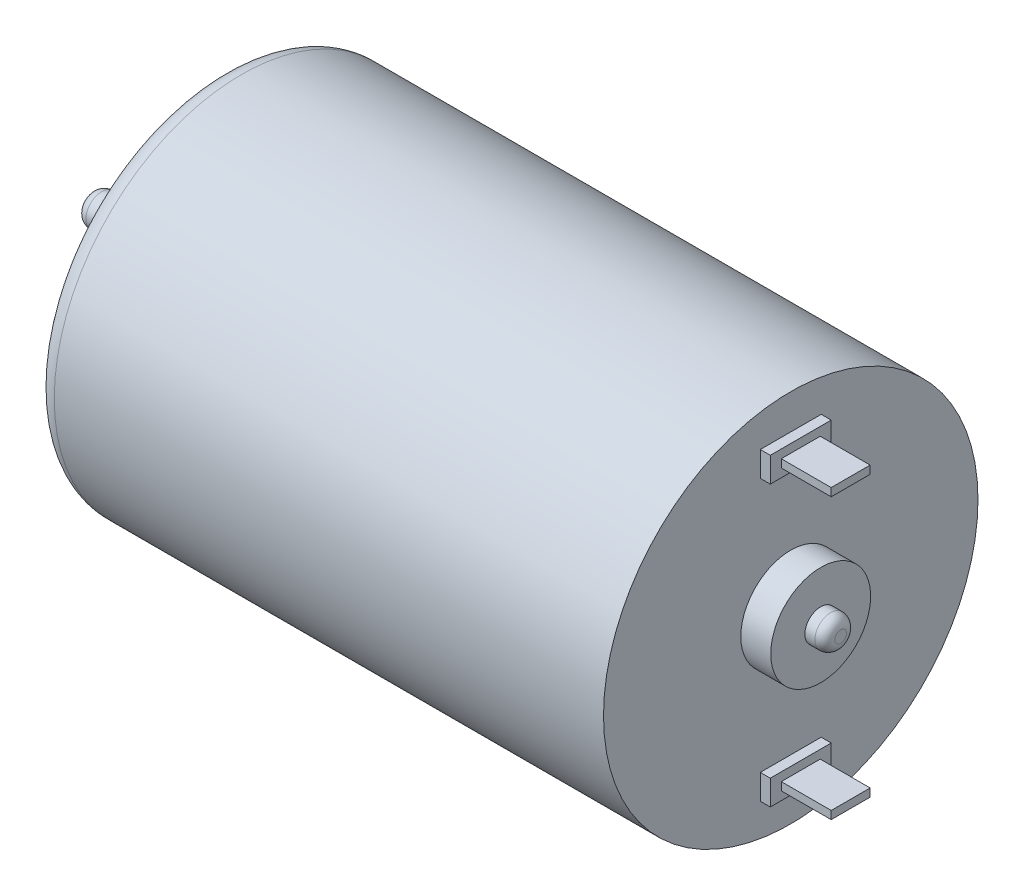
ISO-10303-21;
HEADER;
FILE_DESCRIPTION(('STEP AP214'),'2;1');
FILE_NAME('part.step','',(''),(''),'','','');
FILE_SCHEMA(('AUTOMOTIVE_DESIGN { 1 0 10303 214 1 1 1 1 }'));
ENDSEC;
DATA;
#1=APPLICATION_CONTEXT('core data for automotive mechanical design processes');
#2=APPLICATION_PROTOCOL_DEFINITION('international standard','automotive_design',2000,#1);
#3=PRODUCT_CONTEXT('',#1,'mechanical');
#4=PRODUCT('Part','Part','',(#3));
#5=PRODUCT_RELATED_PRODUCT_CATEGORY('part','',(#4));
#6=PRODUCT_DEFINITION_FORMATION('','',#4);
#7=PRODUCT_DEFINITION_CONTEXT('part definition',#1,'design');
#8=PRODUCT_DEFINITION('design','',#6,#7);
#9=PRODUCT_DEFINITION_SHAPE('','',#8);
#10=(LENGTH_UNIT() NAMED_UNIT(*) SI_UNIT(.MILLI.,.METRE.));
#11=(NAMED_UNIT(*) PLANE_ANGLE_UNIT() SI_UNIT($,.RADIAN.));
#12=(NAMED_UNIT(*) SI_UNIT($,.STERADIAN.) SOLID_ANGLE_UNIT());
#13=UNCERTAINTY_MEASURE_WITH_UNIT(LENGTH_MEASURE(1.E-05),#10,'distance_accuracy_value','');
#14=(GEOMETRIC_REPRESENTATION_CONTEXT(3) GLOBAL_UNCERTAINTY_ASSIGNED_CONTEXT((#13)) GLOBAL_UNIT_ASSIGNED_CONTEXT((#10,
#11,#12)) REPRESENTATION_CONTEXT('',''));
#15=CARTESIAN_POINT('',(0.,0.,0.));
#16=DIRECTION('',(0.,0.,1.));
#17=DIRECTION('',(1.,0.,0.));
#18=AXIS2_PLACEMENT_3D('',#15,#16,#17);
#19=CARTESIAN_POINT('',(67.5,-14.4,-1.95));
#20=DIRECTION('',(0.,1.,0.));
#21=DIRECTION('',(0.,0.,-1.));
#22=AXIS2_PLACEMENT_3D('',#19,#20,#21);
#23=PLANE('',#22);
#24=DIRECTION('',(0.,0.,1.));
#25=VECTOR('',#24,1.);
#26=CARTESIAN_POINT('',(62.5,-14.4,-1.95));
#27=LINE('',#26,#25);
#28=CARTESIAN_POINT('',(62.5,-14.4,-1.95));
#29=VERTEX_POINT('',#28);
#30=CARTESIAN_POINT('',(62.5,-14.4,1.95));
#31=VERTEX_POINT('',#30);
#32=EDGE_CURVE('E135',#29,#31,#27,.T.);
#33=ORIENTED_EDGE('',*,*,#32,.F.);
#34=DIRECTION('',(-1.,0.,0.));
#35=VECTOR('',#34,1.);
#36=CARTESIAN_POINT('',(67.5,-14.4,-1.95));
#37=LINE('',#36,#35);
#38=CARTESIAN_POINT('',(67.5,-14.4,-1.95));
#39=VERTEX_POINT('',#38);
#40=EDGE_CURVE('E134',#39,#29,#37,.T.);
#41=ORIENTED_EDGE('',*,*,#40,.F.);
#42=DIRECTION('',(0.,0.,1.));
#43=VECTOR('',#42,1.);
#44=CARTESIAN_POINT('',(67.5,-14.4,-1.95));
#45=LINE('',#44,#43);
#46=CARTESIAN_POINT('',(67.5,-14.4,1.95));
#47=VERTEX_POINT('',#46);
#48=EDGE_CURVE('E129',#39,#47,#45,.T.);
#49=ORIENTED_EDGE('',*,*,#48,.T.);
#50=DIRECTION('',(-1.,0.,0.));
#51=VECTOR('',#50,1.);
#52=CARTESIAN_POINT('',(67.5,-14.4,1.95));
#53=LINE('',#52,#51);
#54=EDGE_CURVE('E12',#47,#31,#53,.T.);
#55=ORIENTED_EDGE('',*,*,#54,.T.);
#56=EDGE_LOOP('',(#33,#41,#49,#55));
#57=FACE_BOUND('',#56,.T.);
#58=ADVANCED_FACE('F72',(#57),#23,.F.);
#59=CARTESIAN_POINT('',(67.5,-14.4,1.95));
#60=DIRECTION('',(0.,0.,-1.));
#61=DIRECTION('',(-1.,0.,0.));
#62=AXIS2_PLACEMENT_3D('',#59,#60,#61);
#63=PLANE('',#62);
#64=DIRECTION('',(0.,1.,0.));
#65=VECTOR('',#64,1.);
#66=CARTESIAN_POINT('',(62.5,-14.4,1.95));
#67=LINE('',#66,#65);
#68=CARTESIAN_POINT('',(62.5,-13.6,1.95));
#69=VERTEX_POINT('',#68);
#70=EDGE_CURVE('E137',#31,#69,#67,.T.);
#71=ORIENTED_EDGE('',*,*,#70,.F.);
#72=ORIENTED_EDGE('',*,*,#54,.F.);
#73=DIRECTION('',(0.,1.,0.));
#74=VECTOR('',#73,1.);
#75=CARTESIAN_POINT('',(67.5,-14.4,1.95));
#76=LINE('',#75,#74);
#77=CARTESIAN_POINT('',(67.5,-13.6,1.95));
#78=VERTEX_POINT('',#77);
#79=EDGE_CURVE('E113',#47,#78,#76,.T.);
#80=ORIENTED_EDGE('',*,*,#79,.T.);
#81=DIRECTION('',(-1.,0.,0.));
#82=VECTOR('',#81,1.);
#83=CARTESIAN_POINT('',(67.5,-13.6,1.95));
#84=LINE('',#83,#82);
#85=EDGE_CURVE('E80',#78,#69,#84,.T.);
#86=ORIENTED_EDGE('',*,*,#85,.T.);
#87=EDGE_LOOP('',(#71,#72,#80,#86));
#88=FACE_BOUND('',#87,.T.);
#89=ADVANCED_FACE('F127',(#88),#63,.F.);
#90=CARTESIAN_POINT('',(67.5,-13.6,-1.95));
#91=DIRECTION('',(0.,-1.,0.));
#92=DIRECTION('',(0.,0.,1.));
#93=AXIS2_PLACEMENT_3D('',#90,#91,#92);
#94=PLANE('',#93);
#95=DIRECTION('',(0.,0.,-1.));
#96=VECTOR('',#95,1.);
#97=CARTESIAN_POINT('',(62.5,-13.6,-1.95));
#98=LINE('',#97,#96);
#99=CARTESIAN_POINT('',(62.5,-13.6,-1.95));
#100=VERTEX_POINT('',#99);
#101=EDGE_CURVE('E123',#69,#100,#98,.T.);
#102=ORIENTED_EDGE('',*,*,#101,.F.);
#103=ORIENTED_EDGE('',*,*,#85,.F.);
#104=DIRECTION('',(0.,0.,-1.));
#105=VECTOR('',#104,1.);
#106=CARTESIAN_POINT('',(67.5,-13.6,-1.95));
#107=LINE('',#106,#105);
#108=CARTESIAN_POINT('',(67.5,-13.6,-1.95));
#109=VERTEX_POINT('',#108);
#110=EDGE_CURVE('E116',#78,#109,#107,.T.);
#111=ORIENTED_EDGE('',*,*,#110,.T.);
#112=DIRECTION('',(-1.,0.,0.));
#113=VECTOR('',#112,1.);
#114=CARTESIAN_POINT('',(67.5,-13.6,-1.95));
#115=LINE('',#114,#113);
#116=EDGE_CURVE('E126',#109,#100,#115,.T.);
#117=ORIENTED_EDGE('',*,*,#116,.T.);
#118=EDGE_LOOP('',(#102,#103,#111,#117));
#119=FACE_BOUND('',#118,.T.);
#120=ADVANCED_FACE('F122',(#119),#94,.F.);
#121=CARTESIAN_POINT('',(67.5,-14.4,-1.95));
#122=DIRECTION('',(0.,0.,1.));
#123=DIRECTION('',(1.,0.,0.));
#124=AXIS2_PLACEMENT_3D('',#121,#122,#123);
#125=PLANE('',#124);
#126=DIRECTION('',(0.,-1.,0.));
#127=VECTOR('',#126,1.);
#128=CARTESIAN_POINT('',(62.5,-14.4,-1.95));
#129=LINE('',#128,#127);
#130=EDGE_CURVE('E102',#100,#29,#129,.T.);
#131=ORIENTED_EDGE('',*,*,#130,.F.);
#132=ORIENTED_EDGE('',*,*,#116,.F.);
#133=DIRECTION('',(0.,-1.,0.));
#134=VECTOR('',#133,1.);
#135=CARTESIAN_POINT('',(67.5,-14.4,-1.95));
#136=LINE('',#135,#134);
#137=EDGE_CURVE('E88',#109,#39,#136,.T.);
#138=ORIENTED_EDGE('',*,*,#137,.T.);
#139=ORIENTED_EDGE('',*,*,#40,.T.);
#140=EDGE_LOOP('',(#131,#132,#138,#139));
#141=FACE_BOUND('',#140,.T.);
#142=ADVANCED_FACE('F146',(#141),#125,.F.);
#143=CARTESIAN_POINT('',(67.5,0.,0.));
#144=DIRECTION('',(1.,0.,0.));
#145=DIRECTION('',(0.,0.,-1.));
#146=AXIS2_PLACEMENT_3D('',#143,#144,#145);
#147=PLANE('',#146);
#148=ORIENTED_EDGE('',*,*,#48,.F.);
#149=ORIENTED_EDGE('',*,*,#137,.F.);
#150=ORIENTED_EDGE('',*,*,#110,.F.);
#151=ORIENTED_EDGE('',*,*,#79,.F.);
#152=EDGE_LOOP('',(#148,#149,#150,#151));
#153=FACE_BOUND('',#152,.T.);
#154=ADVANCED_FACE('F118',(#153),#147,.T.);
#155=CARTESIAN_POINT('',(62.5,0.,0.));
#156=DIRECTION('',(1.,0.,0.));
#157=DIRECTION('',(0.,0.,-1.));
#158=AXIS2_PLACEMENT_3D('',#155,#156,#157);
#159=PLANE('',#158);
#160=ORIENTED_EDGE('',*,*,#32,.T.);
#161=ORIENTED_EDGE('',*,*,#70,.T.);
#162=ORIENTED_EDGE('',*,*,#101,.T.);
#163=ORIENTED_EDGE('',*,*,#130,.T.);
#164=EDGE_LOOP('',(#160,#161,#162,#163));
#165=FACE_BOUND('',#164,.T.);
#166=ADVANCED_FACE('F142',(#165),#159,.F.);
#167=CLOSED_SHELL('',(#58,#89,#120,#142,#154,#166));
#168=MANIFOLD_SOLID_BREP('B2',#167);
#169=CARTESIAN_POINT('',(62.5,-15.25,-3.05));
#170=DIRECTION('',(0.,1.,0.));
#171=DIRECTION('',(0.,0.,-1.));
#172=AXIS2_PLACEMENT_3D('',#169,#170,#171);
#173=PLANE('',#172);
#174=DIRECTION('',(0.,0.,1.));
#175=VECTOR('',#174,1.);
#176=CARTESIAN_POINT('',(61.5,-15.25,-3.05));
#177=LINE('',#176,#175);
#178=CARTESIAN_POINT('',(61.5,-15.25,-3.05));
#179=VERTEX_POINT('',#178);
#180=CARTESIAN_POINT('',(61.5,-15.25,3.05));
#181=VERTEX_POINT('',#180);
#182=EDGE_CURVE('E305',#179,#181,#177,.T.);
#183=ORIENTED_EDGE('',*,*,#182,.F.);
#184=DIRECTION('',(-1.,0.,0.));
#185=VECTOR('',#184,1.);
#186=CARTESIAN_POINT('',(62.5,-15.25,-3.05));
#187=LINE('',#186,#185);
#188=CARTESIAN_POINT('',(62.5,-15.25,-3.05));
#189=VERTEX_POINT('',#188);
#190=EDGE_CURVE('E304',#189,#179,#187,.T.);
#191=ORIENTED_EDGE('',*,*,#190,.F.);
#192=DIRECTION('',(0.,0.,1.));
#193=VECTOR('',#192,1.);
#194=CARTESIAN_POINT('',(62.5,-15.25,-3.05));
#195=LINE('',#194,#193);
#196=CARTESIAN_POINT('',(62.5,-15.25,3.05));
#197=VERTEX_POINT('',#196);
#198=EDGE_CURVE('E299',#189,#197,#195,.T.);
#199=ORIENTED_EDGE('',*,*,#198,.T.);
#200=DIRECTION('',(-1.,0.,0.));
#201=VECTOR('',#200,1.);
#202=CARTESIAN_POINT('',(62.5,-15.25,3.05));
#203=LINE('',#202,#201);
#204=EDGE_CURVE('E70',#197,#181,#203,.T.);
#205=ORIENTED_EDGE('',*,*,#204,.T.);
#206=EDGE_LOOP('',(#183,#191,#199,#205));
#207=FACE_BOUND('',#206,.T.);
#208=ADVANCED_FACE('F242',(#207),#173,.F.);
#209=CARTESIAN_POINT('',(62.5,-15.25,3.05));
#210=DIRECTION('',(0.,0.,-1.));
#211=DIRECTION('',(0.,-1.,0.));
#212=AXIS2_PLACEMENT_3D('',#209,#210,#211);
#213=PLANE('',#212);
#214=DIRECTION('',(0.,1.,0.));
#215=VECTOR('',#214,1.);
#216=CARTESIAN_POINT('',(61.5,-15.25,3.05));
#217=LINE('',#216,#215);
#218=CARTESIAN_POINT('',(61.5,-12.75,3.05));
#219=VERTEX_POINT('',#218);
#220=EDGE_CURVE('E307',#181,#219,#217,.T.);
#221=ORIENTED_EDGE('',*,*,#220,.F.);
#222=ORIENTED_EDGE('',*,*,#204,.F.);
#223=DIRECTION('',(0.,1.,0.));
#224=VECTOR('',#223,1.);
#225=CARTESIAN_POINT('',(62.5,-15.25,3.05));
#226=LINE('',#225,#224);
#227=CARTESIAN_POINT('',(62.5,-12.75,3.05));
#228=VERTEX_POINT('',#227);
#229=EDGE_CURVE('E283',#197,#228,#226,.T.);
#230=ORIENTED_EDGE('',*,*,#229,.T.);
#231=DIRECTION('',(-1.,0.,0.));
#232=VECTOR('',#231,1.);
#233=CARTESIAN_POINT('',(62.5,-12.75,3.05));
#234=LINE('',#233,#232);
#235=EDGE_CURVE('E250',#228,#219,#234,.T.);
#236=ORIENTED_EDGE('',*,*,#235,.T.);
#237=EDGE_LOOP('',(#221,#222,#230,#236));
#238=FACE_BOUND('',#237,.T.);
#239=ADVANCED_FACE('F297',(#238),#213,.F.);
#240=CARTESIAN_POINT('',(62.5,-12.75,-3.05));
#241=DIRECTION('',(0.,-1.,0.));
#242=DIRECTION('',(0.,0.,1.));
#243=AXIS2_PLACEMENT_3D('',#240,#241,#242);
#244=PLANE('',#243);
#245=DIRECTION('',(0.,0.,-1.));
#246=VECTOR('',#245,1.);
#247=CARTESIAN_POINT('',(61.5,-12.75,-3.05));
#248=LINE('',#247,#246);
#249=CARTESIAN_POINT('',(61.5,-12.75,-3.05));
#250=VERTEX_POINT('',#249);
#251=EDGE_CURVE('E293',#219,#250,#248,.T.);
#252=ORIENTED_EDGE('',*,*,#251,.F.);
#253=ORIENTED_EDGE('',*,*,#235,.F.);
#254=DIRECTION('',(0.,0.,-1.));
#255=VECTOR('',#254,1.);
#256=CARTESIAN_POINT('',(62.5,-12.75,-3.05));
#257=LINE('',#256,#255);
#258=CARTESIAN_POINT('',(62.5,-12.75,-3.05));
#259=VERTEX_POINT('',#258);
#260=EDGE_CURVE('E286',#228,#259,#257,.T.);
#261=ORIENTED_EDGE('',*,*,#260,.T.);
#262=DIRECTION('',(-1.,0.,0.));
#263=VECTOR('',#262,1.);
#264=CARTESIAN_POINT('',(62.5,-12.75,-3.05));
#265=LINE('',#264,#263);
#266=EDGE_CURVE('E296',#259,#250,#265,.T.);
#267=ORIENTED_EDGE('',*,*,#266,.T.);
#268=EDGE_LOOP('',(#252,#253,#261,#267));
#269=FACE_BOUND('',#268,.T.);
#270=ADVANCED_FACE('F292',(#269),#244,.F.);
#271=CARTESIAN_POINT('',(62.5,-15.25,-3.05));
#272=DIRECTION('',(0.,0.,1.));
#273=DIRECTION('',(1.,0.,0.));
#274=AXIS2_PLACEMENT_3D('',#271,#272,#273);
#275=PLANE('',#274);
#276=DIRECTION('',(0.,-1.,0.));
#277=VECTOR('',#276,1.);
#278=CARTESIAN_POINT('',(61.5,-15.25,-3.05));
#279=LINE('',#278,#277);
#280=EDGE_CURVE('E272',#250,#179,#279,.T.);
#281=ORIENTED_EDGE('',*,*,#280,.F.);
#282=ORIENTED_EDGE('',*,*,#266,.F.);
#283=DIRECTION('',(0.,-1.,0.));
#284=VECTOR('',#283,1.);
#285=CARTESIAN_POINT('',(62.5,-15.25,-3.05));
#286=LINE('',#285,#284);
#287=EDGE_CURVE('E258',#259,#189,#286,.T.);
#288=ORIENTED_EDGE('',*,*,#287,.T.);
#289=ORIENTED_EDGE('',*,*,#190,.T.);
#290=EDGE_LOOP('',(#281,#282,#288,#289));
#291=FACE_BOUND('',#290,.T.);
#292=ADVANCED_FACE('F316',(#291),#275,.F.);
#293=CARTESIAN_POINT('',(62.5,0.,0.));
#294=DIRECTION('',(1.,0.,0.));
#295=DIRECTION('',(0.,0.,-1.));
#296=AXIS2_PLACEMENT_3D('',#293,#294,#295);
#297=PLANE('',#296);
#298=ORIENTED_EDGE('',*,*,#198,.F.);
#299=ORIENTED_EDGE('',*,*,#287,.F.);
#300=ORIENTED_EDGE('',*,*,#260,.F.);
#301=ORIENTED_EDGE('',*,*,#229,.F.);
#302=EDGE_LOOP('',(#298,#299,#300,#301));
#303=FACE_BOUND('',#302,.T.);
#304=ADVANCED_FACE('F288',(#303),#297,.T.);
#305=CARTESIAN_POINT('',(61.5,0.,0.));
#306=DIRECTION('',(1.,0.,0.));
#307=DIRECTION('',(0.,0.,-1.));
#308=AXIS2_PLACEMENT_3D('',#305,#306,#307);
#309=PLANE('',#308);
#310=ORIENTED_EDGE('',*,*,#182,.T.);
#311=ORIENTED_EDGE('',*,*,#220,.T.);
#312=ORIENTED_EDGE('',*,*,#251,.T.);
#313=ORIENTED_EDGE('',*,*,#280,.T.);
#314=EDGE_LOOP('',(#310,#311,#312,#313));
#315=FACE_BOUND('',#314,.T.);
#316=ADVANCED_FACE('F312',(#315),#309,.F.);
#317=CLOSED_SHELL('',(#208,#239,#270,#292,#304,#316));
#318=MANIFOLD_SOLID_BREP('B6',#317);
#319=CARTESIAN_POINT('',(67.5,14.4,-1.95));
#320=DIRECTION('',(0.,-1.,0.));
#321=DIRECTION('',(0.,0.,-1.));
#322=AXIS2_PLACEMENT_3D('',#319,#320,#321);
#323=PLANE('',#322);
#324=DIRECTION('',(0.,0.,1.));
#325=VECTOR('',#324,1.);
#326=CARTESIAN_POINT('',(62.5,14.4,-1.95));
#327=LINE('',#326,#325);
#328=CARTESIAN_POINT('',(62.5,14.4,-1.95));
#329=VERTEX_POINT('',#328);
#330=CARTESIAN_POINT('',(62.5,14.4,1.95));
#331=VERTEX_POINT('',#330);
#332=EDGE_CURVE('E475',#329,#331,#327,.T.);
#333=ORIENTED_EDGE('',*,*,#332,.T.);
#334=DIRECTION('',(-1.,0.,0.));
#335=VECTOR('',#334,1.);
#336=CARTESIAN_POINT('',(67.5,14.4,1.95));
#337=LINE('',#336,#335);
#338=CARTESIAN_POINT('',(67.5,14.4,1.95));
#339=VERTEX_POINT('',#338);
#340=EDGE_CURVE('E240',#339,#331,#337,.T.);
#341=ORIENTED_EDGE('',*,*,#340,.F.);
#342=DIRECTION('',(0.,0.,1.));
#343=VECTOR('',#342,1.);
#344=CARTESIAN_POINT('',(67.5,14.4,-1.95));
#345=LINE('',#344,#343);
#346=CARTESIAN_POINT('',(67.5,14.4,-1.95));
#347=VERTEX_POINT('',#346);
#348=EDGE_CURVE('E463',#347,#339,#345,.T.);
#349=ORIENTED_EDGE('',*,*,#348,.F.);
#350=DIRECTION('',(-1.,0.,0.));
#351=VECTOR('',#350,1.);
#352=CARTESIAN_POINT('',(67.5,14.4,-1.95));
#353=LINE('',#352,#351);
#354=EDGE_CURVE('E471',#347,#329,#353,.T.);
#355=ORIENTED_EDGE('',*,*,#354,.T.);
#356=EDGE_LOOP('',(#333,#341,#349,#355));
#357=FACE_BOUND('',#356,.T.);
#358=ADVANCED_FACE('F412',(#357),#323,.F.);
#359=CARTESIAN_POINT('',(67.5,14.4,1.95));
#360=DIRECTION('',(0.,0.,-1.));
#361=DIRECTION('',(-1.,0.,0.));
#362=AXIS2_PLACEMENT_3D('',#359,#360,#361);
#363=PLANE('',#362);
#364=DIRECTION('',(0.,-1.,0.));
#365=VECTOR('',#364,1.);
#366=CARTESIAN_POINT('',(62.5,14.4,1.95));
#367=LINE('',#366,#365);
#368=CARTESIAN_POINT('',(62.5,13.6,1.95));
#369=VERTEX_POINT('',#368);
#370=EDGE_CURVE('E467',#331,#369,#367,.T.);
#371=ORIENTED_EDGE('',*,*,#370,.T.);
#372=DIRECTION('',(-1.,0.,0.));
#373=VECTOR('',#372,1.);
#374=CARTESIAN_POINT('',(67.5,13.6,1.95));
#375=LINE('',#374,#373);
#376=CARTESIAN_POINT('',(67.5,13.6,1.95));
#377=VERTEX_POINT('',#376);
#378=EDGE_CURVE('E420',#377,#369,#375,.T.);
#379=ORIENTED_EDGE('',*,*,#378,.F.);
#380=DIRECTION('',(0.,-1.,0.));
#381=VECTOR('',#380,1.);
#382=CARTESIAN_POINT('',(67.5,14.4,1.95));
#383=LINE('',#382,#381);
#384=EDGE_CURVE('E458',#339,#377,#383,.T.);
#385=ORIENTED_EDGE('',*,*,#384,.F.);
#386=ORIENTED_EDGE('',*,*,#340,.T.);
#387=EDGE_LOOP('',(#371,#379,#385,#386));
#388=FACE_BOUND('',#387,.T.);
#389=ADVANCED_FACE('F466',(#388),#363,.F.);
#390=CARTESIAN_POINT('',(67.5,13.6,-1.95));
#391=DIRECTION('',(0.,1.,0.));
#392=DIRECTION('',(0.,0.,1.));
#393=AXIS2_PLACEMENT_3D('',#390,#391,#392);
#394=PLANE('',#393);
#395=DIRECTION('',(0.,0.,-1.));
#396=VECTOR('',#395,1.);
#397=CARTESIAN_POINT('',(62.5,13.6,-1.95));
#398=LINE('',#397,#396);
#399=CARTESIAN_POINT('',(62.5,13.6,-1.95));
#400=VERTEX_POINT('',#399);
#401=EDGE_CURVE('E445',#369,#400,#398,.T.);
#402=ORIENTED_EDGE('',*,*,#401,.T.);
#403=DIRECTION('',(-1.,0.,0.));
#404=VECTOR('',#403,1.);
#405=CARTESIAN_POINT('',(67.5,13.6,-1.95));
#406=LINE('',#405,#404);
#407=CARTESIAN_POINT('',(67.5,13.6,-1.95));
#408=VERTEX_POINT('',#407);
#409=EDGE_CURVE('E468',#408,#400,#406,.T.);
#410=ORIENTED_EDGE('',*,*,#409,.F.);
#411=DIRECTION('',(0.,0.,-1.));
#412=VECTOR('',#411,1.);
#413=CARTESIAN_POINT('',(67.5,13.6,-1.95));
#414=LINE('',#413,#412);
#415=EDGE_CURVE('E461',#377,#408,#414,.T.);
#416=ORIENTED_EDGE('',*,*,#415,.F.);
#417=ORIENTED_EDGE('',*,*,#378,.T.);
#418=EDGE_LOOP('',(#402,#410,#416,#417));
#419=FACE_BOUND('',#418,.T.);
#420=ADVANCED_FACE('F469',(#419),#394,.F.);
#421=CARTESIAN_POINT('',(67.5,14.4,-1.95));
#422=DIRECTION('',(0.,0.,1.));
#423=DIRECTION('',(1.,0.,0.));
#424=AXIS2_PLACEMENT_3D('',#421,#422,#423);
#425=PLANE('',#424);
#426=DIRECTION('',(0.,1.,0.));
#427=VECTOR('',#426,1.);
#428=CARTESIAN_POINT('',(62.5,14.4,-1.95));
#429=LINE('',#428,#427);
#430=EDGE_CURVE('E451',#400,#329,#429,.T.);
#431=ORIENTED_EDGE('',*,*,#430,.T.);
#432=ORIENTED_EDGE('',*,*,#354,.F.);
#433=DIRECTION('',(0.,1.,0.));
#434=VECTOR('',#433,1.);
#435=CARTESIAN_POINT('',(67.5,14.4,-1.95));
#436=LINE('',#435,#434);
#437=EDGE_CURVE('E428',#408,#347,#436,.T.);
#438=ORIENTED_EDGE('',*,*,#437,.F.);
#439=ORIENTED_EDGE('',*,*,#409,.T.);
#440=EDGE_LOOP('',(#431,#432,#438,#439));
#441=FACE_BOUND('',#440,.T.);
#442=ADVANCED_FACE('F482',(#441),#425,.F.);
#443=CARTESIAN_POINT('',(67.5,0.,0.));
#444=DIRECTION('',(1.,0.,0.));
#445=DIRECTION('',(0.,0.,-1.));
#446=AXIS2_PLACEMENT_3D('',#443,#444,#445);
#447=PLANE('',#446);
#448=ORIENTED_EDGE('',*,*,#348,.T.);
#449=ORIENTED_EDGE('',*,*,#384,.T.);
#450=ORIENTED_EDGE('',*,*,#415,.T.);
#451=ORIENTED_EDGE('',*,*,#437,.T.);
#452=EDGE_LOOP('',(#448,#449,#450,#451));
#453=FACE_BOUND('',#452,.T.);
#454=ADVANCED_FACE('F459',(#453),#447,.T.);
#455=CARTESIAN_POINT('',(62.5,0.,0.));
#456=DIRECTION('',(1.,0.,0.));
#457=DIRECTION('',(0.,0.,-1.));
#458=AXIS2_PLACEMENT_3D('',#455,#456,#457);
#459=PLANE('',#458);
#460=ORIENTED_EDGE('',*,*,#332,.F.);
#461=ORIENTED_EDGE('',*,*,#430,.F.);
#462=ORIENTED_EDGE('',*,*,#401,.F.);
#463=ORIENTED_EDGE('',*,*,#370,.F.);
#464=EDGE_LOOP('',(#460,#461,#462,#463));
#465=FACE_BOUND('',#464,.T.);
#466=ADVANCED_FACE('F485',(#465),#459,.F.);
#467=CLOSED_SHELL('',(#358,#389,#420,#442,#454,#466));
#468=MANIFOLD_SOLID_BREP('B64',#467);
#469=CARTESIAN_POINT('',(62.5,15.25,-3.05));
#470=DIRECTION('',(0.,-1.,0.));
#471=DIRECTION('',(0.,0.,-1.));
#472=AXIS2_PLACEMENT_3D('',#469,#470,#471);
#473=PLANE('',#472);
#474=DIRECTION('',(0.,0.,1.));
#475=VECTOR('',#474,1.);
#476=CARTESIAN_POINT('',(61.5,15.25,-3.05));
#477=LINE('',#476,#475);
#478=CARTESIAN_POINT('',(61.5,15.25,-3.05));
#479=VERTEX_POINT('',#478);
#480=CARTESIAN_POINT('',(61.5,15.25,3.05));
#481=VERTEX_POINT('',#480);
#482=EDGE_CURVE('E611',#479,#481,#477,.T.);
#483=ORIENTED_EDGE('',*,*,#482,.T.);
#484=DIRECTION('',(-1.,0.,0.));
#485=VECTOR('',#484,1.);
#486=CARTESIAN_POINT('',(62.5,15.25,3.05));
#487=LINE('',#486,#485);
#488=CARTESIAN_POINT('',(62.5,15.25,3.05));
#489=VERTEX_POINT('',#488);
#490=EDGE_CURVE('E410',#489,#481,#487,.T.);
#491=ORIENTED_EDGE('',*,*,#490,.F.);
#492=DIRECTION('',(0.,0.,1.));
#493=VECTOR('',#492,1.);
#494=CARTESIAN_POINT('',(62.5,15.25,-3.05));
#495=LINE('',#494,#493);
#496=CARTESIAN_POINT('',(62.5,15.25,-3.05));
#497=VERTEX_POINT('',#496);
#498=EDGE_CURVE('E598',#497,#489,#495,.T.);
#499=ORIENTED_EDGE('',*,*,#498,.F.);
#500=DIRECTION('',(-1.,0.,0.));
#501=VECTOR('',#500,1.);
#502=CARTESIAN_POINT('',(62.5,15.25,-3.05));
#503=LINE('',#502,#501);
#504=EDGE_CURVE('E607',#497,#479,#503,.T.);
#505=ORIENTED_EDGE('',*,*,#504,.T.);
#506=EDGE_LOOP('',(#483,#491,#499,#505));
#507=FACE_BOUND('',#506,.T.);
#508=ADVANCED_FACE('F546',(#507),#473,.F.);
#509=CARTESIAN_POINT('',(62.5,15.25,3.05));
#510=DIRECTION('',(0.,0.,-1.));
#511=DIRECTION('',(0.,1.,0.));
#512=AXIS2_PLACEMENT_3D('',#509,#510,#511);
#513=PLANE('',#512);
#514=DIRECTION('',(0.,-1.,0.));
#515=VECTOR('',#514,1.);
#516=CARTESIAN_POINT('',(61.5,15.25,3.05));
#517=LINE('',#516,#515);
#518=CARTESIAN_POINT('',(61.5,12.75,3.05));
#519=VERTEX_POINT('',#518);
#520=EDGE_CURVE('E602',#481,#519,#517,.T.);
#521=ORIENTED_EDGE('',*,*,#520,.T.);
#522=DIRECTION('',(-1.,0.,0.));
#523=VECTOR('',#522,1.);
#524=CARTESIAN_POINT('',(62.5,12.75,3.05));
#525=LINE('',#524,#523);
#526=CARTESIAN_POINT('',(62.5,12.75,3.05));
#527=VERTEX_POINT('',#526);
#528=EDGE_CURVE('E554',#527,#519,#525,.T.);
#529=ORIENTED_EDGE('',*,*,#528,.F.);
#530=DIRECTION('',(0.,-1.,0.));
#531=VECTOR('',#530,1.);
#532=CARTESIAN_POINT('',(62.5,15.25,3.05));
#533=LINE('',#532,#531);
#534=EDGE_CURVE('E593',#489,#527,#533,.T.);
#535=ORIENTED_EDGE('',*,*,#534,.F.);
#536=ORIENTED_EDGE('',*,*,#490,.T.);
#537=EDGE_LOOP('',(#521,#529,#535,#536));
#538=FACE_BOUND('',#537,.T.);
#539=ADVANCED_FACE('F601',(#538),#513,.F.);
#540=CARTESIAN_POINT('',(62.5,12.75,-3.05));
#541=DIRECTION('',(0.,1.,0.));
#542=DIRECTION('',(0.,0.,1.));
#543=AXIS2_PLACEMENT_3D('',#540,#541,#542);
#544=PLANE('',#543);
#545=DIRECTION('',(0.,0.,-1.));
#546=VECTOR('',#545,1.);
#547=CARTESIAN_POINT('',(61.5,12.75,-3.05));
#548=LINE('',#547,#546);
#549=CARTESIAN_POINT('',(61.5,12.75,-3.05));
#550=VERTEX_POINT('',#549);
#551=EDGE_CURVE('E580',#519,#550,#548,.T.);
#552=ORIENTED_EDGE('',*,*,#551,.T.);
#553=DIRECTION('',(-1.,0.,0.));
#554=VECTOR('',#553,1.);
#555=CARTESIAN_POINT('',(62.5,12.75,-3.05));
#556=LINE('',#555,#554);
#557=CARTESIAN_POINT('',(62.5,12.75,-3.05));
#558=VERTEX_POINT('',#557);
#559=EDGE_CURVE('E604',#558,#550,#556,.T.);
#560=ORIENTED_EDGE('',*,*,#559,.F.);
#561=DIRECTION('',(0.,0.,-1.));
#562=VECTOR('',#561,1.);
#563=CARTESIAN_POINT('',(62.5,12.75,-3.05));
#564=LINE('',#563,#562);
#565=EDGE_CURVE('E596',#527,#558,#564,.T.);
#566=ORIENTED_EDGE('',*,*,#565,.F.);
#567=ORIENTED_EDGE('',*,*,#528,.T.);
#568=EDGE_LOOP('',(#552,#560,#566,#567));
#569=FACE_BOUND('',#568,.T.);
#570=ADVANCED_FACE('F605',(#569),#544,.F.);
#571=CARTESIAN_POINT('',(62.5,15.25,-3.05));
#572=DIRECTION('',(0.,0.,1.));
#573=DIRECTION('',(1.,0.,0.));
#574=AXIS2_PLACEMENT_3D('',#571,#572,#573);
#575=PLANE('',#574);
#576=DIRECTION('',(0.,1.,0.));
#577=VECTOR('',#576,1.);
#578=CARTESIAN_POINT('',(61.5,15.25,-3.05));
#579=LINE('',#578,#577);
#580=EDGE_CURVE('E586',#550,#479,#579,.T.);
#581=ORIENTED_EDGE('',*,*,#580,.T.);
#582=ORIENTED_EDGE('',*,*,#504,.F.);
#583=DIRECTION('',(0.,1.,0.));
#584=VECTOR('',#583,1.);
#585=CARTESIAN_POINT('',(62.5,15.25,-3.05));
#586=LINE('',#585,#584);
#587=EDGE_CURVE('E562',#558,#497,#586,.T.);
#588=ORIENTED_EDGE('',*,*,#587,.F.);
#589=ORIENTED_EDGE('',*,*,#559,.T.);
#590=EDGE_LOOP('',(#581,#582,#588,#589));
#591=FACE_BOUND('',#590,.T.);
#592=ADVANCED_FACE('F620',(#591),#575,.F.);
#593=CARTESIAN_POINT('',(62.5,0.,0.));
#594=DIRECTION('',(1.,0.,0.));
#595=DIRECTION('',(0.,0.,-1.));
#596=AXIS2_PLACEMENT_3D('',#593,#594,#595);
#597=PLANE('',#596);
#598=ORIENTED_EDGE('',*,*,#498,.T.);
#599=ORIENTED_EDGE('',*,*,#534,.T.);
#600=ORIENTED_EDGE('',*,*,#565,.T.);
#601=ORIENTED_EDGE('',*,*,#587,.T.);
#602=EDGE_LOOP('',(#598,#599,#600,#601));
#603=FACE_BOUND('',#602,.T.);
#604=ADVANCED_FACE('F594',(#603),#597,.T.);
#605=CARTESIAN_POINT('',(61.5,0.,0.));
#606=DIRECTION('',(1.,0.,0.));
#607=DIRECTION('',(0.,0.,-1.));
#608=AXIS2_PLACEMENT_3D('',#605,#606,#607);
#609=PLANE('',#608);
#610=ORIENTED_EDGE('',*,*,#482,.F.);
#611=ORIENTED_EDGE('',*,*,#580,.F.);
#612=ORIENTED_EDGE('',*,*,#551,.F.);
#613=ORIENTED_EDGE('',*,*,#520,.F.);
#614=EDGE_LOOP('',(#610,#611,#612,#613));
#615=FACE_BOUND('',#614,.T.);
#616=ADVANCED_FACE('F623',(#615),#609,.F.);
#617=CLOSED_SHELL('',(#508,#539,#570,#592,#604,#616));
#618=MANIFOLD_SOLID_BREP('B234',#617);
#619=CARTESIAN_POINT('',(64.5,5.,0.));
#620=DIRECTION('',(-1.,0.,0.));
#621=DIRECTION('',(0.,0.,1.));
#622=AXIS2_PLACEMENT_3D('',#619,#620,#621);
#623=PLANE('',#622);
#624=CARTESIAN_POINT('',(64.5,0.,0.));
#625=DIRECTION('',(-1.,0.,0.));
#626=DIRECTION('',(0.,0.,1.));
#627=AXIS2_PLACEMENT_3D('',#624,#625,#626);
#628=CIRCLE('',#627,5.);
#629=CARTESIAN_POINT('',(64.5,0.,5.));
#630=VERTEX_POINT('',#629);
#631=EDGE_CURVE('E723',#630,#630,#628,.T.);
#632=ORIENTED_EDGE('',*,*,#631,.F.);
#633=EDGE_LOOP('',(#632));
#634=FACE_BOUND('',#633,.T.);
#635=CARTESIAN_POINT('',(64.5,0.,0.));
#636=DIRECTION('',(-1.,0.,0.));
#637=DIRECTION('',(0.,0.,1.));
#638=AXIS2_PLACEMENT_3D('',#635,#636,#637);
#639=CIRCLE('',#638,1.5875);
#640=CARTESIAN_POINT('',(64.5,0.,1.5875));
#641=VERTEX_POINT('',#640);
#642=EDGE_CURVE('E743',#641,#641,#639,.T.);
#643=ORIENTED_EDGE('',*,*,#642,.T.);
#644=EDGE_LOOP('',(#643));
#645=FACE_BOUND('',#644,.T.);
#646=ADVANCED_FACE('F683',(#634,#645),#623,.F.);
#647=CARTESIAN_POINT('',(0.,0.,0.));
#648=DIRECTION('',(-1.,0.,0.));
#649=DIRECTION('',(0.,0.,1.));
#650=AXIS2_PLACEMENT_3D('',#647,#648,#649);
#651=CYLINDRICAL_SURFACE('',#650,1.5875);
#652=ORIENTED_EDGE('',*,*,#642,.F.);
#653=EDGE_LOOP('',(#652));
#654=FACE_BOUND('',#653,.T.);
#655=CARTESIAN_POINT('',(0.,0.,0.));
#656=DIRECTION('',(-1.,0.,0.));
#657=DIRECTION('',(0.,0.,1.));
#658=AXIS2_PLACEMENT_3D('',#655,#656,#657);
#659=CIRCLE('',#658,1.5875);
#660=CARTESIAN_POINT('',(0.,0.,1.5875));
#661=VERTEX_POINT('',#660);
#662=EDGE_CURVE('E739',#661,#661,#659,.T.);
#663=ORIENTED_EDGE('',*,*,#662,.T.);
#664=EDGE_LOOP('',(#663));
#665=FACE_BOUND('',#664,.T.);
#666=ADVANCED_FACE('F773',(#654,#665),#651,.F.);
#667=CARTESIAN_POINT('',(0.,1.5875,0.));
#668=DIRECTION('',(1.,0.,0.));
#669=DIRECTION('',(0.,0.,-1.));
#670=AXIS2_PLACEMENT_3D('',#667,#668,#669);
#671=PLANE('',#670);
#672=CARTESIAN_POINT('',(0.,0.,0.));
#673=DIRECTION('',(1.,0.,0.));
#674=DIRECTION('',(0.,0.,-1.));
#675=AXIS2_PLACEMENT_3D('',#672,#673,#674);
#676=CIRCLE('',#675,5.99999999999999);
#677=CARTESIAN_POINT('',(0.,0.,-5.99999999999999));
#678=VERTEX_POINT('',#677);
#679=EDGE_CURVE('E693',#678,#678,#676,.F.);
#680=ORIENTED_EDGE('',*,*,#679,.T.);
#681=EDGE_LOOP('',(#680));
#682=FACE_BOUND('',#681,.T.);
#683=ORIENTED_EDGE('',*,*,#662,.F.);
#684=EDGE_LOOP('',(#683));
#685=FACE_BOUND('',#684,.T.);
#686=ADVANCED_FACE('F758',(#682,#685),#671,.F.);
#687=CARTESIAN_POINT('',(0.,0.,0.));
#688=DIRECTION('',(-1.,0.,0.));
#689=DIRECTION('',(0.,0.,1.));
#690=AXIS2_PLACEMENT_3D('',#687,#688,#689);
#691=CYLINDRICAL_SURFACE('',#690,6.5);
#692=CARTESIAN_POINT('',(0.500000000000011,0.,0.));
#693=DIRECTION('',(1.,0.,0.));
#694=DIRECTION('',(0.,0.,-1.));
#695=AXIS2_PLACEMENT_3D('',#692,#693,#694);
#696=CIRCLE('',#695,6.5);
#697=CARTESIAN_POINT('',(0.500000000000011,0.,-6.5));
#698=VERTEX_POINT('',#697);
#699=EDGE_CURVE('E544',#698,#698,#696,.T.);
#700=ORIENTED_EDGE('',*,*,#699,.T.);
#701=EDGE_LOOP('',(#700));
#702=FACE_BOUND('',#701,.T.);
#703=CARTESIAN_POINT('',(4.5,0.,0.));
#704=DIRECTION('',(-1.,0.,0.));
#705=DIRECTION('',(0.,0.,1.));
#706=AXIS2_PLACEMENT_3D('',#703,#704,#705);
#707=CIRCLE('',#706,6.5);
#708=CARTESIAN_POINT('',(4.5,0.,6.5));
#709=VERTEX_POINT('',#708);
#710=EDGE_CURVE('E735',#709,#709,#707,.T.);
#711=ORIENTED_EDGE('',*,*,#710,.T.);
#712=EDGE_LOOP('',(#711));
#713=FACE_BOUND('',#712,.T.);
#714=ADVANCED_FACE('F787',(#702,#713),#691,.T.);
#715=CARTESIAN_POINT('',(4.5,6.5,0.));
#716=DIRECTION('',(1.,0.,0.));
#717=DIRECTION('',(0.,0.,-1.));
#718=AXIS2_PLACEMENT_3D('',#715,#716,#717);
#719=PLANE('',#718);
#720=CARTESIAN_POINT('',(4.5,-12.5,0.));
#721=DIRECTION('',(-1.,0.,0.));
#722=DIRECTION('',(0.,0.,1.));
#723=AXIS2_PLACEMENT_3D('',#720,#721,#722);
#724=CIRCLE('',#723,1.24999999999999);
#725=CARTESIAN_POINT('',(4.5,-12.5,1.24999999999999));
#726=VERTEX_POINT('',#725);
#727=EDGE_CURVE('E710',#726,#726,#724,.T.);
#728=ORIENTED_EDGE('',*,*,#727,.F.);
#729=EDGE_LOOP('',(#728));
#730=FACE_BOUND('',#729,.T.);
#731=CARTESIAN_POINT('',(4.5,0.,0.));
#732=DIRECTION('',(1.,0.,0.));
#733=DIRECTION('',(0.,0.,-1.));
#734=AXIS2_PLACEMENT_3D('',#731,#732,#733);
#735=CIRCLE('',#734,16.75);
#736=CARTESIAN_POINT('',(4.5,0.,-16.75));
#737=VERTEX_POINT('',#736);
#738=EDGE_CURVE('E747',#737,#737,#735,.F.);
#739=ORIENTED_EDGE('',*,*,#738,.T.);
#740=EDGE_LOOP('',(#739));
#741=FACE_BOUND('',#740,.T.);
#742=CARTESIAN_POINT('',(4.5,12.5,0.));
#743=DIRECTION('',(-1.,0.,0.));
#744=DIRECTION('',(0.,0.,1.));
#745=AXIS2_PLACEMENT_3D('',#742,#743,#744);
#746=CIRCLE('',#745,1.24999999999999);
#747=CARTESIAN_POINT('',(4.5,12.5,1.24999999999999));
#748=VERTEX_POINT('',#747);
#749=EDGE_CURVE('E709',#748,#748,#746,.T.);
#750=ORIENTED_EDGE('',*,*,#749,.F.);
#751=EDGE_LOOP('',(#750));
#752=FACE_BOUND('',#751,.T.);
#753=ORIENTED_EDGE('',*,*,#710,.F.);
#754=EDGE_LOOP('',(#753));
#755=FACE_BOUND('',#754,.T.);
#756=ADVANCED_FACE('F789',(#730,#741,#752,#755),#719,.F.);
#757=CARTESIAN_POINT('',(0.,0.,0.));
#758=DIRECTION('',(-1.,0.,0.));
#759=DIRECTION('',(0.,0.,1.));
#760=AXIS2_PLACEMENT_3D('',#757,#758,#759);
#761=CYLINDRICAL_SURFACE('',#760,18.75);
#762=CARTESIAN_POINT('',(6.5,0.,0.));
#763=DIRECTION('',(1.,0.,0.));
#764=DIRECTION('',(0.,0.,-1.));
#765=AXIS2_PLACEMENT_3D('',#762,#763,#764);
#766=CIRCLE('',#765,18.75);
#767=CARTESIAN_POINT('',(6.5,0.,-18.75));
#768=VERTEX_POINT('',#767);
#769=EDGE_CURVE('E751',#768,#768,#766,.T.);
#770=ORIENTED_EDGE('',*,*,#769,.T.);
#771=EDGE_LOOP('',(#770));
#772=FACE_BOUND('',#771,.T.);
#773=CARTESIAN_POINT('',(61.5,0.,0.));
#774=DIRECTION('',(-1.,0.,0.));
#775=DIRECTION('',(0.,0.,1.));
#776=AXIS2_PLACEMENT_3D('',#773,#774,#775);
#777=CIRCLE('',#776,18.75);
#778=CARTESIAN_POINT('',(61.5,0.,18.75));
#779=VERTEX_POINT('',#778);
#780=EDGE_CURVE('E731',#779,#779,#777,.T.);
#781=ORIENTED_EDGE('',*,*,#780,.T.);
#782=EDGE_LOOP('',(#781));
#783=FACE_BOUND('',#782,.T.);
#784=ADVANCED_FACE('F793',(#772,#783),#761,.T.);
#785=CARTESIAN_POINT('',(61.5,18.75,0.));
#786=DIRECTION('',(-1.,0.,0.));
#787=DIRECTION('',(0.,0.,1.));
#788=AXIS2_PLACEMENT_3D('',#785,#786,#787);
#789=PLANE('',#788);
#790=ORIENTED_EDGE('',*,*,#780,.F.);
#791=EDGE_LOOP('',(#790));
#792=FACE_BOUND('',#791,.T.);
#793=CARTESIAN_POINT('',(61.5,0.,0.));
#794=DIRECTION('',(-1.,0.,0.));
#795=DIRECTION('',(0.,0.,1.));
#796=AXIS2_PLACEMENT_3D('',#793,#794,#795);
#797=CIRCLE('',#796,5.);
#798=CARTESIAN_POINT('',(61.5,0.,5.));
#799=VERTEX_POINT('',#798);
#800=EDGE_CURVE('E727',#799,#799,#797,.T.);
#801=ORIENTED_EDGE('',*,*,#800,.T.);
#802=EDGE_LOOP('',(#801));
#803=FACE_BOUND('',#802,.T.);
#804=ADVANCED_FACE('F796',(#792,#803),#789,.F.);
#805=CARTESIAN_POINT('',(0.,0.,0.));
#806=DIRECTION('',(-1.,0.,0.));
#807=DIRECTION('',(0.,0.,1.));
#808=AXIS2_PLACEMENT_3D('',#805,#806,#807);
#809=CYLINDRICAL_SURFACE('',#808,5.);
#810=ORIENTED_EDGE('',*,*,#800,.F.);
#811=EDGE_LOOP('',(#810));
#812=FACE_BOUND('',#811,.T.);
#813=ORIENTED_EDGE('',*,*,#631,.T.);
#814=EDGE_LOOP('',(#813));
#815=FACE_BOUND('',#814,.T.);
#816=ADVANCED_FACE('F800',(#812,#815),#809,.T.);
#817=CARTESIAN_POINT('',(13.,12.5,0.));
#818=DIRECTION('',(-1.,0.,0.));
#819=DIRECTION('',(0.,0.,1.));
#820=AXIS2_PLACEMENT_3D('',#817,#818,#819);
#821=CONICAL_SURFACE('',#820,1.24999999999999,1.02974425867665);
#822=CARTESIAN_POINT('',(13.7510757737845,12.5,0.));
#823=VERTEX_POINT('',#822);
#824=VERTEX_LOOP('',#823);
#825=FACE_BOUND('',#824,.T.);
#826=CARTESIAN_POINT('',(13.,12.5,0.));
#827=DIRECTION('',(-1.,0.,0.));
#828=DIRECTION('',(0.,0.,1.));
#829=AXIS2_PLACEMENT_3D('',#826,#827,#828);
#830=CIRCLE('',#829,1.24999999999999);
#831=CARTESIAN_POINT('',(13.,12.5,1.24999999999999));
#832=VERTEX_POINT('',#831);
#833=EDGE_CURVE('E715',#832,#832,#830,.T.);
#834=ORIENTED_EDGE('',*,*,#833,.T.);
#835=EDGE_LOOP('',(#834));
#836=FACE_BOUND('',#835,.T.);
#837=ADVANCED_FACE('F803',(#825,#836),#821,.F.);
#838=CARTESIAN_POINT('',(4.5,12.5,0.));
#839=DIRECTION('',(-1.,0.,0.));
#840=DIRECTION('',(0.,0.,1.));
#841=AXIS2_PLACEMENT_3D('',#838,#839,#840);
#842=CYLINDRICAL_SURFACE('',#841,1.24999999999999);
#843=ORIENTED_EDGE('',*,*,#833,.F.);
#844=EDGE_LOOP('',(#843));
#845=FACE_BOUND('',#844,.T.);
#846=ORIENTED_EDGE('',*,*,#749,.T.);
#847=EDGE_LOOP('',(#846));
#848=FACE_BOUND('',#847,.T.);
#849=ADVANCED_FACE('F769',(#845,#848),#842,.F.);
#850=CARTESIAN_POINT('',(6.5,0.,0.));
#851=DIRECTION('',(1.,0.,0.));
#852=DIRECTION('',(0.,0.,-1.));
#853=AXIS2_PLACEMENT_3D('',#850,#851,#852);
#854=TOROIDAL_SURFACE('',#853,16.75,2.);
#855=ORIENTED_EDGE('',*,*,#769,.F.);
#856=EDGE_LOOP('',(#855));
#857=FACE_BOUND('',#856,.T.);
#858=ORIENTED_EDGE('',*,*,#738,.F.);
#859=EDGE_LOOP('',(#858));
#860=FACE_BOUND('',#859,.T.);
#861=ADVANCED_FACE('F762',(#857,#860),#854,.T.);
#862=CARTESIAN_POINT('',(0.,0.,0.));
#863=DIRECTION('',(1.,0.,0.));
#864=DIRECTION('',(0.,0.,-1.));
#865=AXIS2_PLACEMENT_3D('',#862,#863,#864);
#866=CONICAL_SURFACE('',#865,5.99999999999999,0.785398163397446);
#867=ORIENTED_EDGE('',*,*,#699,.F.);
#868=EDGE_LOOP('',(#867));
#869=FACE_BOUND('',#868,.T.);
#870=ORIENTED_EDGE('',*,*,#679,.F.);
#871=EDGE_LOOP('',(#870));
#872=FACE_BOUND('',#871,.T.);
#873=ADVANCED_FACE('F686',(#869,#872),#866,.T.);
#874=CARTESIAN_POINT('',(13.,-12.5,0.));
#875=DIRECTION('',(-1.,0.,0.));
#876=DIRECTION('',(0.,0.,1.));
#877=AXIS2_PLACEMENT_3D('',#874,#875,#876);
#878=CONICAL_SURFACE('',#877,1.24999999999999,1.02974425867665);
#879=CARTESIAN_POINT('',(13.7510757737845,-12.5,0.));
#880=VERTEX_POINT('',#879);
#881=VERTEX_LOOP('',#880);
#882=FACE_BOUND('',#881,.T.);
#883=CARTESIAN_POINT('',(13.,-12.5,0.));
#884=DIRECTION('',(-1.,0.,0.));
#885=DIRECTION('',(0.,0.,1.));
#886=AXIS2_PLACEMENT_3D('',#883,#884,#885);
#887=CIRCLE('',#886,1.24999999999999);
#888=CARTESIAN_POINT('',(13.,-12.5,1.24999999999999));
#889=VERTEX_POINT('',#888);
#890=EDGE_CURVE('E706',#889,#889,#887,.T.);
#891=ORIENTED_EDGE('',*,*,#890,.T.);
#892=EDGE_LOOP('',(#891));
#893=FACE_BOUND('',#892,.T.);
#894=ADVANCED_FACE('F699',(#882,#893),#878,.F.);
#895=CARTESIAN_POINT('',(4.5,-12.5,0.));
#896=DIRECTION('',(-1.,0.,0.));
#897=DIRECTION('',(0.,0.,1.));
#898=AXIS2_PLACEMENT_3D('',#895,#896,#897);
#899=CYLINDRICAL_SURFACE('',#898,1.24999999999999);
#900=ORIENTED_EDGE('',*,*,#890,.F.);
#901=EDGE_LOOP('',(#900));
#902=FACE_BOUND('',#901,.T.);
#903=ORIENTED_EDGE('',*,*,#727,.T.);
#904=EDGE_LOOP('',(#903));
#905=FACE_BOUND('',#904,.T.);
#906=ADVANCED_FACE('F702',(#902,#905),#899,.F.);
#907=CLOSED_SHELL('',(#646,#666,#686,#714,#756,#784,#804,#816,#837,#849,#861,#873,#894,#906));
#908=MANIFOLD_SOLID_BREP('B404',#907);
#909=CARTESIAN_POINT('',(66.5,1.5875,0.));
#910=DIRECTION('',(-1.,0.,0.));
#911=DIRECTION('',(0.,0.,1.));
#912=AXIS2_PLACEMENT_3D('',#909,#910,#911);
#913=PLANE('',#912);
#914=CARTESIAN_POINT('',(66.5,0.,0.));
#915=DIRECTION('',(-1.,0.,0.));
#916=DIRECTION('',(0.,0.,1.));
#917=AXIS2_PLACEMENT_3D('',#914,#915,#916);
#918=CIRCLE('',#917,0.587499999999999);
#919=CARTESIAN_POINT('',(66.5,0.,0.587499999999999));
#920=VERTEX_POINT('',#919);
#921=EDGE_CURVE('E970',#920,#920,#918,.F.);
#922=ORIENTED_EDGE('',*,*,#921,.T.);
#923=EDGE_LOOP('',(#922));
#924=FACE_BOUND('',#923,.T.);
#925=ADVANCED_FACE('F963',(#924),#913,.F.);
#926=CARTESIAN_POINT('',(-8.5,0.,0.));
#927=DIRECTION('',(1.,0.,0.));
#928=DIRECTION('',(0.,0.,-1.));
#929=AXIS2_PLACEMENT_3D('',#926,#927,#928);
#930=PLANE('',#929);
#931=CARTESIAN_POINT('',(-8.5,0.,0.));
#932=DIRECTION('',(1.,0.,0.));
#933=DIRECTION('',(0.,0.,-1.));
#934=AXIS2_PLACEMENT_3D('',#931,#932,#933);
#935=CIRCLE('',#934,0.587499999999999);
#936=CARTESIAN_POINT('',(-8.5,0.,-0.587499999999999));
#937=VERTEX_POINT('',#936);
#938=EDGE_CURVE('E682',#937,#937,#935,.F.);
#939=ORIENTED_EDGE('',*,*,#938,.T.);
#940=EDGE_LOOP('',(#939));
#941=FACE_BOUND('',#940,.T.);
#942=ADVANCED_FACE('F995',(#941),#930,.F.);
#943=CARTESIAN_POINT('',(0.,0.,0.));
#944=DIRECTION('',(-1.,0.,0.));
#945=DIRECTION('',(0.,0.,1.));
#946=AXIS2_PLACEMENT_3D('',#943,#944,#945);
#947=CYLINDRICAL_SURFACE('',#946,1.5875);
#948=CARTESIAN_POINT('',(65.5,0.,0.));
#949=DIRECTION('',(-1.,0.,0.));
#950=DIRECTION('',(0.,0.,1.));
#951=AXIS2_PLACEMENT_3D('',#948,#949,#950);
#952=CIRCLE('',#951,1.5875);
#953=CARTESIAN_POINT('',(65.5,0.,1.5875));
#954=VERTEX_POINT('',#953);
#955=EDGE_CURVE('E974',#954,#954,#952,.T.);
#956=ORIENTED_EDGE('',*,*,#955,.T.);
#957=EDGE_LOOP('',(#956));
#958=FACE_BOUND('',#957,.T.);
#959=CARTESIAN_POINT('',(-7.5,0.,0.));
#960=DIRECTION('',(1.,0.,0.));
#961=DIRECTION('',(0.,0.,-1.));
#962=AXIS2_PLACEMENT_3D('',#959,#960,#961);
#963=CIRCLE('',#962,1.5875);
#964=CARTESIAN_POINT('',(-7.5,0.,-1.5875));
#965=VERTEX_POINT('',#964);
#966=EDGE_CURVE('E979',#965,#965,#963,.T.);
#967=ORIENTED_EDGE('',*,*,#966,.T.);
#968=EDGE_LOOP('',(#967));
#969=FACE_BOUND('',#968,.T.);
#970=ADVANCED_FACE('F985',(#958,#969),#947,.T.);
#971=CARTESIAN_POINT('',(65.5,0.,0.));
#972=DIRECTION('',(-1.,0.,0.));
#973=DIRECTION('',(0.,0.,1.));
#974=AXIS2_PLACEMENT_3D('',#971,#972,#973);
#975=DEGENERATE_TOROIDAL_SURFACE('',#974,0.587499999999999,1.,.T.);
#976=ORIENTED_EDGE('',*,*,#921,.F.);
#977=EDGE_LOOP('',(#976));
#978=FACE_BOUND('',#977,.T.);
#979=ORIENTED_EDGE('',*,*,#955,.F.);
#980=EDGE_LOOP('',(#979));
#981=FACE_BOUND('',#980,.T.);
#982=ADVANCED_FACE('F989',(#978,#981),#975,.T.);
#983=CARTESIAN_POINT('',(-7.5,0.,0.));
#984=DIRECTION('',(1.,0.,0.));
#985=DIRECTION('',(0.,0.,-1.));
#986=AXIS2_PLACEMENT_3D('',#983,#984,#985);
#987=DEGENERATE_TOROIDAL_SURFACE('',#986,0.587499999999999,1.,.T.);
#988=ORIENTED_EDGE('',*,*,#966,.F.);
#989=EDGE_LOOP('',(#988));
#990=FACE_BOUND('',#989,.T.);
#991=ORIENTED_EDGE('',*,*,#938,.F.);
#992=EDGE_LOOP('',(#991));
#993=FACE_BOUND('',#992,.T.);
#994=ADVANCED_FACE('F965',(#990,#993),#987,.T.);
#995=CLOSED_SHELL('',(#925,#942,#970,#982,#994));
#996=MANIFOLD_SOLID_BREP('B538',#995);
#997=ADVANCED_BREP_SHAPE_REPRESENTATION('',(#18,#168,#318,#468,#618,#908,#996),#14);
#998=SHAPE_DEFINITION_REPRESENTATION(#9,#997);
ENDSEC;
END-ISO-10303-21;
